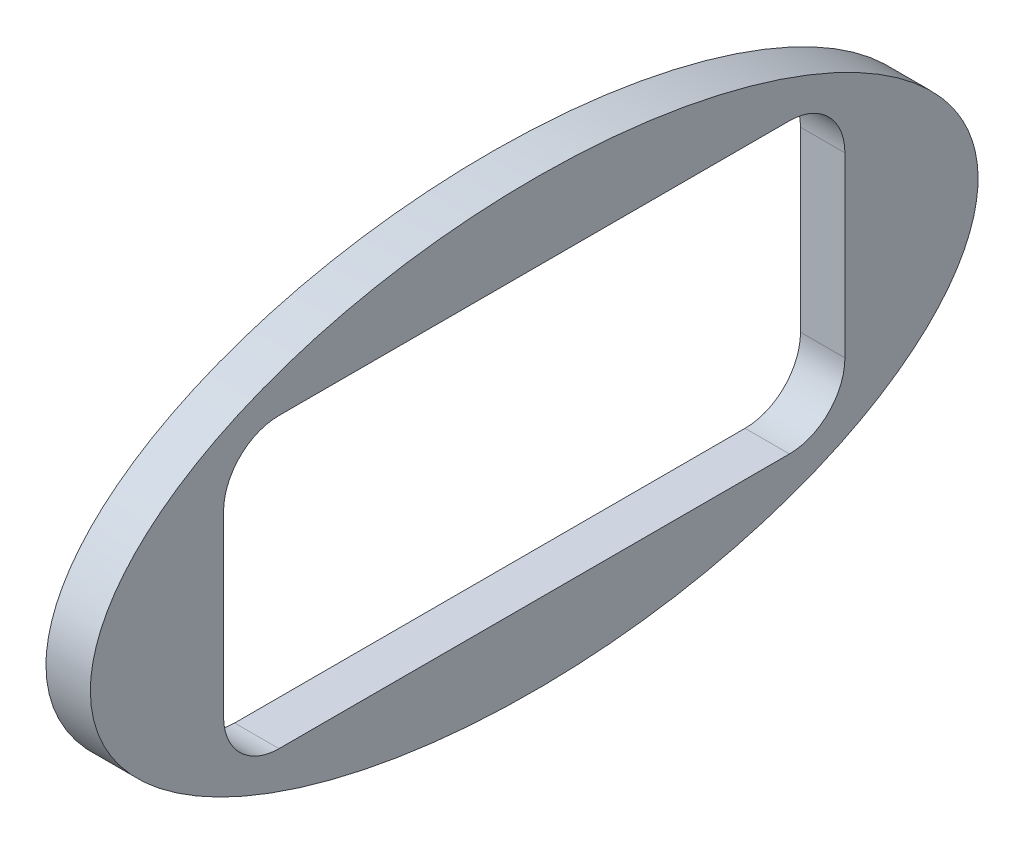
ISO-10303-21;
HEADER;
FILE_DESCRIPTION(('STEP AP214'),'2;1');
FILE_NAME('part.step','',(''),(''),'','','');
FILE_SCHEMA(('AUTOMOTIVE_DESIGN { 1 0 10303 214 1 1 1 1 }'));
ENDSEC;
DATA;
#1=APPLICATION_CONTEXT('core data for automotive mechanical design processes');
#2=APPLICATION_PROTOCOL_DEFINITION('international standard','automotive_design',2000,#1);
#3=PRODUCT_CONTEXT('',#1,'mechanical');
#4=PRODUCT('Part','Part','',(#3));
#5=PRODUCT_RELATED_PRODUCT_CATEGORY('part','',(#4));
#6=PRODUCT_DEFINITION_FORMATION('','',#4);
#7=PRODUCT_DEFINITION_CONTEXT('part definition',#1,'design');
#8=PRODUCT_DEFINITION('design','',#6,#7);
#9=PRODUCT_DEFINITION_SHAPE('','',#8);
#10=(LENGTH_UNIT() NAMED_UNIT(*) SI_UNIT(.MILLI.,.METRE.));
#11=(NAMED_UNIT(*) PLANE_ANGLE_UNIT() SI_UNIT($,.RADIAN.));
#12=(NAMED_UNIT(*) SI_UNIT($,.STERADIAN.) SOLID_ANGLE_UNIT());
#13=UNCERTAINTY_MEASURE_WITH_UNIT(LENGTH_MEASURE(1.E-05),#10,'distance_accuracy_value','');
#14=(GEOMETRIC_REPRESENTATION_CONTEXT(3) GLOBAL_UNCERTAINTY_ASSIGNED_CONTEXT((#13)) GLOBAL_UNIT_ASSIGNED_CONTEXT((#10,
#11,#12)) REPRESENTATION_CONTEXT('',''));
#15=CARTESIAN_POINT('',(0.,0.,0.));
#16=DIRECTION('',(0.,0.,1.));
#17=DIRECTION('',(1.,0.,0.));
#18=AXIS2_PLACEMENT_3D('',#15,#16,#17);
#19=CARTESIAN_POINT('',(1.,0.,0.));
#20=DIRECTION('',(1.,0.,0.));
#21=DIRECTION('',(0.,0.,-1.));
#22=AXIS2_PLACEMENT_3D('',#19,#20,#21);
#23=PLANE('',#22);
#24=CARTESIAN_POINT('',(1.,0.,0.));
#25=DIRECTION('',(1.,0.,0.));
#26=DIRECTION('',(0.,0.,1.));
#27=AXIS2_PLACEMENT_3D('',#24,#25,#26);
#28=ELLIPSE('',#27,10.,5.);
#29=CARTESIAN_POINT('',(1.,0.,10.));
#30=VERTEX_POINT('',#29);
#31=EDGE_CURVE('E11',#30,#30,#28,.T.);
#32=ORIENTED_EDGE('',*,*,#31,.T.);
#33=EDGE_LOOP('',(#32));
#34=FACE_BOUND('',#33,.T.);
#35=DIRECTION('',(0.,0.,-1.));
#36=VECTOR('',#35,1.);
#37=CARTESIAN_POINT('',(1.,-3.25,5.75));
#38=LINE('',#37,#36);
#39=CARTESIAN_POINT('',(1.,-3.25,5.75));
#40=VERTEX_POINT('',#39);
#41=CARTESIAN_POINT('',(1.,-3.25,-5.75));
#42=VERTEX_POINT('',#41);
#43=EDGE_CURVE('E110',#40,#42,#38,.T.);
#44=ORIENTED_EDGE('',*,*,#43,.F.);
#45=CARTESIAN_POINT('',(1.,-2.,5.75));
#46=DIRECTION('',(1.,0.,0.));
#47=DIRECTION('',(0.,0.,1.));
#48=AXIS2_PLACEMENT_3D('',#45,#46,#47);
#49=CIRCLE('',#48,1.25);
#50=CARTESIAN_POINT('',(1.,-2.,7.));
#51=VERTEX_POINT('',#50);
#52=EDGE_CURVE('E102',#51,#40,#49,.T.);
#53=ORIENTED_EDGE('',*,*,#52,.F.);
#54=DIRECTION('',(0.,-1.,0.));
#55=VECTOR('',#54,1.);
#56=CARTESIAN_POINT('',(1.,-2.,7.));
#57=LINE('',#56,#55);
#58=CARTESIAN_POINT('',(1.,2.,7.));
#59=VERTEX_POINT('',#58);
#60=EDGE_CURVE('E134',#59,#51,#57,.T.);
#61=ORIENTED_EDGE('',*,*,#60,.F.);
#62=CARTESIAN_POINT('',(1.,2.,5.75));
#63=DIRECTION('',(1.,0.,0.));
#64=DIRECTION('',(0.,0.,1.));
#65=AXIS2_PLACEMENT_3D('',#62,#63,#64);
#66=CIRCLE('',#65,1.25);
#67=CARTESIAN_POINT('',(1.,3.25,5.75));
#68=VERTEX_POINT('',#67);
#69=EDGE_CURVE('E132',#68,#59,#66,.T.);
#70=ORIENTED_EDGE('',*,*,#69,.F.);
#71=DIRECTION('',(0.,0.,1.));
#72=VECTOR('',#71,1.);
#73=CARTESIAN_POINT('',(1.,3.25,5.75));
#74=LINE('',#73,#72);
#75=CARTESIAN_POINT('',(1.,3.25,-5.75));
#76=VERTEX_POINT('',#75);
#77=EDGE_CURVE('E130',#76,#68,#74,.T.);
#78=ORIENTED_EDGE('',*,*,#77,.F.);
#79=CARTESIAN_POINT('',(1.,2.,-5.75));
#80=DIRECTION('',(1.,0.,0.));
#81=DIRECTION('',(0.,0.,1.));
#82=AXIS2_PLACEMENT_3D('',#79,#80,#81);
#83=CIRCLE('',#82,1.25);
#84=CARTESIAN_POINT('',(1.,2.,-7.));
#85=VERTEX_POINT('',#84);
#86=EDGE_CURVE('E128',#85,#76,#83,.T.);
#87=ORIENTED_EDGE('',*,*,#86,.F.);
#88=DIRECTION('',(0.,1.,0.));
#89=VECTOR('',#88,1.);
#90=CARTESIAN_POINT('',(1.,-2.,-7.));
#91=LINE('',#90,#89);
#92=CARTESIAN_POINT('',(1.,-2.,-7.));
#93=VERTEX_POINT('',#92);
#94=EDGE_CURVE('E124',#93,#85,#91,.T.);
#95=ORIENTED_EDGE('',*,*,#94,.F.);
#96=CARTESIAN_POINT('',(1.,-2.,-5.75));
#97=DIRECTION('',(1.,0.,0.));
#98=DIRECTION('',(0.,0.,-1.));
#99=AXIS2_PLACEMENT_3D('',#96,#97,#98);
#100=CIRCLE('',#99,1.25);
#101=EDGE_CURVE('E122',#42,#93,#100,.T.);
#102=ORIENTED_EDGE('',*,*,#101,.F.);
#103=EDGE_LOOP('',(#44,#53,#61,#70,#78,#87,#95,#102));
#104=FACE_BOUND('',#103,.T.);
#105=ADVANCED_FACE('F37',(#34,#104),#23,.T.);
#106=CARTESIAN_POINT('',(0.,0.,0.));
#107=DIRECTION('',(1.,0.,0.));
#108=DIRECTION('',(0.,0.,-1.));
#109=AXIS2_PLACEMENT_3D('',#106,#107,#108);
#110=PLANE('',#109);
#111=CARTESIAN_POINT('',(0.,0.,0.));
#112=DIRECTION('',(1.,0.,0.));
#113=DIRECTION('',(0.,0.,1.));
#114=AXIS2_PLACEMENT_3D('',#111,#112,#113);
#115=ELLIPSE('',#114,10.,5.);
#116=CARTESIAN_POINT('',(0.,0.,10.));
#117=VERTEX_POINT('',#116);
#118=EDGE_CURVE('E42',#117,#117,#115,.T.);
#119=ORIENTED_EDGE('',*,*,#118,.F.);
#120=EDGE_LOOP('',(#119));
#121=FACE_BOUND('',#120,.T.);
#122=CARTESIAN_POINT('',(0.,-2.,5.75));
#123=DIRECTION('',(1.,0.,0.));
#124=DIRECTION('',(0.,0.,1.));
#125=AXIS2_PLACEMENT_3D('',#122,#123,#124);
#126=CIRCLE('',#125,1.25);
#127=CARTESIAN_POINT('',(0.,-2.,7.));
#128=VERTEX_POINT('',#127);
#129=CARTESIAN_POINT('',(0.,-3.25,5.75));
#130=VERTEX_POINT('',#129);
#131=EDGE_CURVE('E60',#128,#130,#126,.T.);
#132=ORIENTED_EDGE('',*,*,#131,.T.);
#133=DIRECTION('',(0.,0.,-1.));
#134=VECTOR('',#133,1.);
#135=CARTESIAN_POINT('',(0.,-3.25,5.75));
#136=LINE('',#135,#134);
#137=CARTESIAN_POINT('',(0.,-3.25,-5.75));
#138=VERTEX_POINT('',#137);
#139=EDGE_CURVE('E117',#130,#138,#136,.T.);
#140=ORIENTED_EDGE('',*,*,#139,.T.);
#141=CARTESIAN_POINT('',(0.,-2.,-5.75));
#142=DIRECTION('',(1.,0.,0.));
#143=DIRECTION('',(0.,0.,-1.));
#144=AXIS2_PLACEMENT_3D('',#141,#142,#143);
#145=CIRCLE('',#144,1.25);
#146=CARTESIAN_POINT('',(0.,-2.,-7.));
#147=VERTEX_POINT('',#146);
#148=EDGE_CURVE('E138',#138,#147,#145,.T.);
#149=ORIENTED_EDGE('',*,*,#148,.T.);
#150=DIRECTION('',(0.,1.,0.));
#151=VECTOR('',#150,1.);
#152=CARTESIAN_POINT('',(0.,-2.,-7.));
#153=LINE('',#152,#151);
#154=CARTESIAN_POINT('',(0.,2.,-7.));
#155=VERTEX_POINT('',#154);
#156=EDGE_CURVE('E141',#147,#155,#153,.T.);
#157=ORIENTED_EDGE('',*,*,#156,.T.);
#158=CARTESIAN_POINT('',(0.,2.,-5.75));
#159=DIRECTION('',(1.,0.,0.));
#160=DIRECTION('',(0.,0.,1.));
#161=AXIS2_PLACEMENT_3D('',#158,#159,#160);
#162=CIRCLE('',#161,1.25);
#163=CARTESIAN_POINT('',(0.,3.25,-5.75));
#164=VERTEX_POINT('',#163);
#165=EDGE_CURVE('E144',#155,#164,#162,.T.);
#166=ORIENTED_EDGE('',*,*,#165,.T.);
#167=DIRECTION('',(0.,0.,1.));
#168=VECTOR('',#167,1.);
#169=CARTESIAN_POINT('',(0.,3.25,5.75));
#170=LINE('',#169,#168);
#171=CARTESIAN_POINT('',(0.,3.25,5.75));
#172=VERTEX_POINT('',#171);
#173=EDGE_CURVE('E147',#164,#172,#170,.T.);
#174=ORIENTED_EDGE('',*,*,#173,.T.);
#175=CARTESIAN_POINT('',(0.,2.,5.75));
#176=DIRECTION('',(1.,0.,0.));
#177=DIRECTION('',(0.,0.,1.));
#178=AXIS2_PLACEMENT_3D('',#175,#176,#177);
#179=CIRCLE('',#178,1.25);
#180=CARTESIAN_POINT('',(0.,2.,7.));
#181=VERTEX_POINT('',#180);
#182=EDGE_CURVE('E150',#172,#181,#179,.T.);
#183=ORIENTED_EDGE('',*,*,#182,.T.);
#184=DIRECTION('',(0.,-1.,0.));
#185=VECTOR('',#184,1.);
#186=CARTESIAN_POINT('',(0.,-2.,7.));
#187=LINE('',#186,#185);
#188=EDGE_CURVE('E111',#181,#128,#187,.T.);
#189=ORIENTED_EDGE('',*,*,#188,.T.);
#190=EDGE_LOOP('',(#132,#140,#149,#157,#166,#174,#183,#189));
#191=FACE_BOUND('',#190,.T.);
#192=ADVANCED_FACE('F172',(#121,#191),#110,.F.);
#193=DIRECTION('',(-1.,0.,0.));
#194=VECTOR('',#193,1.);
#195=SURFACE_OF_LINEAR_EXTRUSION('',#28,#194);
#196=ORIENTED_EDGE('',*,*,#31,.F.);
#197=EDGE_LOOP('',(#196));
#198=FACE_BOUND('',#197,.T.);
#199=ORIENTED_EDGE('',*,*,#118,.T.);
#200=EDGE_LOOP('',(#199));
#201=FACE_BOUND('',#200,.T.);
#202=ADVANCED_FACE('F39',(#198,#201),#195,.F.);
#203=CARTESIAN_POINT('',(1.,-2.,5.75));
#204=DIRECTION('',(-1.,0.,0.));
#205=DIRECTION('',(0.,0.,1.));
#206=AXIS2_PLACEMENT_3D('',#203,#204,#205);
#207=CYLINDRICAL_SURFACE('',#206,1.25);
#208=ORIENTED_EDGE('',*,*,#131,.F.);
#209=DIRECTION('',(-1.,0.,0.));
#210=VECTOR('',#209,1.);
#211=CARTESIAN_POINT('',(1.,-2.,7.));
#212=LINE('',#211,#210);
#213=EDGE_CURVE('E106',#51,#128,#212,.T.);
#214=ORIENTED_EDGE('',*,*,#213,.F.);
#215=ORIENTED_EDGE('',*,*,#52,.T.);
#216=DIRECTION('',(-1.,0.,0.));
#217=VECTOR('',#216,1.);
#218=CARTESIAN_POINT('',(1.,-3.25,5.75));
#219=LINE('',#218,#217);
#220=EDGE_CURVE('E105',#40,#130,#219,.T.);
#221=ORIENTED_EDGE('',*,*,#220,.T.);
#222=EDGE_LOOP('',(#208,#214,#215,#221));
#223=FACE_BOUND('',#222,.T.);
#224=ADVANCED_FACE('F104',(#223),#207,.F.);
#225=CARTESIAN_POINT('',(1.,-3.25,5.75));
#226=DIRECTION('',(0.,1.,0.));
#227=DIRECTION('',(0.,0.,1.));
#228=AXIS2_PLACEMENT_3D('',#225,#226,#227);
#229=PLANE('',#228);
#230=ORIENTED_EDGE('',*,*,#139,.F.);
#231=ORIENTED_EDGE('',*,*,#220,.F.);
#232=ORIENTED_EDGE('',*,*,#43,.T.);
#233=DIRECTION('',(-1.,0.,0.));
#234=VECTOR('',#233,1.);
#235=CARTESIAN_POINT('',(1.,-3.25,-5.75));
#236=LINE('',#235,#234);
#237=EDGE_CURVE('E118',#42,#138,#236,.T.);
#238=ORIENTED_EDGE('',*,*,#237,.T.);
#239=EDGE_LOOP('',(#230,#231,#232,#238));
#240=FACE_BOUND('',#239,.T.);
#241=ADVANCED_FACE('F114',(#240),#229,.T.);
#242=CARTESIAN_POINT('',(1.,-2.,-5.75));
#243=DIRECTION('',(-1.,0.,0.));
#244=DIRECTION('',(0.,0.,1.));
#245=AXIS2_PLACEMENT_3D('',#242,#243,#244);
#246=CYLINDRICAL_SURFACE('',#245,1.25);
#247=ORIENTED_EDGE('',*,*,#148,.F.);
#248=ORIENTED_EDGE('',*,*,#237,.F.);
#249=ORIENTED_EDGE('',*,*,#101,.T.);
#250=DIRECTION('',(-1.,0.,0.));
#251=VECTOR('',#250,1.);
#252=CARTESIAN_POINT('',(1.,-2.,-7.));
#253=LINE('',#252,#251);
#254=EDGE_CURVE('E163',#93,#147,#253,.T.);
#255=ORIENTED_EDGE('',*,*,#254,.T.);
#256=EDGE_LOOP('',(#247,#248,#249,#255));
#257=FACE_BOUND('',#256,.T.);
#258=ADVANCED_FACE('F168',(#257),#246,.F.);
#259=CARTESIAN_POINT('',(1.,-2.,-7.));
#260=DIRECTION('',(0.,0.,1.));
#261=DIRECTION('',(1.,0.,0.));
#262=AXIS2_PLACEMENT_3D('',#259,#260,#261);
#263=PLANE('',#262);
#264=ORIENTED_EDGE('',*,*,#156,.F.);
#265=ORIENTED_EDGE('',*,*,#254,.F.);
#266=ORIENTED_EDGE('',*,*,#94,.T.);
#267=DIRECTION('',(-1.,0.,0.));
#268=VECTOR('',#267,1.);
#269=CARTESIAN_POINT('',(1.,2.,-7.));
#270=LINE('',#269,#268);
#271=EDGE_CURVE('E161',#85,#155,#270,.T.);
#272=ORIENTED_EDGE('',*,*,#271,.T.);
#273=EDGE_LOOP('',(#264,#265,#266,#272));
#274=FACE_BOUND('',#273,.T.);
#275=ADVANCED_FACE('F190',(#274),#263,.T.);
#276=CARTESIAN_POINT('',(1.,2.,-5.75));
#277=DIRECTION('',(-1.,0.,0.));
#278=DIRECTION('',(0.,0.,1.));
#279=AXIS2_PLACEMENT_3D('',#276,#277,#278);
#280=CYLINDRICAL_SURFACE('',#279,1.25);
#281=ORIENTED_EDGE('',*,*,#165,.F.);
#282=ORIENTED_EDGE('',*,*,#271,.F.);
#283=ORIENTED_EDGE('',*,*,#86,.T.);
#284=DIRECTION('',(-1.,0.,0.));
#285=VECTOR('',#284,1.);
#286=CARTESIAN_POINT('',(1.,3.25,-5.75));
#287=LINE('',#286,#285);
#288=EDGE_CURVE('E159',#76,#164,#287,.T.);
#289=ORIENTED_EDGE('',*,*,#288,.T.);
#290=EDGE_LOOP('',(#281,#282,#283,#289));
#291=FACE_BOUND('',#290,.T.);
#292=ADVANCED_FACE('F187',(#291),#280,.F.);
#293=CARTESIAN_POINT('',(1.,3.25,5.75));
#294=DIRECTION('',(0.,-1.,0.));
#295=DIRECTION('',(0.,0.,-1.));
#296=AXIS2_PLACEMENT_3D('',#293,#294,#295);
#297=PLANE('',#296);
#298=ORIENTED_EDGE('',*,*,#173,.F.);
#299=ORIENTED_EDGE('',*,*,#288,.F.);
#300=ORIENTED_EDGE('',*,*,#77,.T.);
#301=DIRECTION('',(-1.,0.,0.));
#302=VECTOR('',#301,1.);
#303=CARTESIAN_POINT('',(1.,3.25,5.75));
#304=LINE('',#303,#302);
#305=EDGE_CURVE('E157',#68,#172,#304,.T.);
#306=ORIENTED_EDGE('',*,*,#305,.T.);
#307=EDGE_LOOP('',(#298,#299,#300,#306));
#308=FACE_BOUND('',#307,.T.);
#309=ADVANCED_FACE('F183',(#308),#297,.T.);
#310=CARTESIAN_POINT('',(1.,2.,5.75));
#311=DIRECTION('',(-1.,0.,0.));
#312=DIRECTION('',(0.,0.,1.));
#313=AXIS2_PLACEMENT_3D('',#310,#311,#312);
#314=CYLINDRICAL_SURFACE('',#313,1.25);
#315=ORIENTED_EDGE('',*,*,#182,.F.);
#316=ORIENTED_EDGE('',*,*,#305,.F.);
#317=ORIENTED_EDGE('',*,*,#69,.T.);
#318=DIRECTION('',(-1.,0.,0.));
#319=VECTOR('',#318,1.);
#320=CARTESIAN_POINT('',(1.,2.,7.));
#321=LINE('',#320,#319);
#322=EDGE_CURVE('E52',#59,#181,#321,.T.);
#323=ORIENTED_EDGE('',*,*,#322,.T.);
#324=EDGE_LOOP('',(#315,#316,#317,#323));
#325=FACE_BOUND('',#324,.T.);
#326=ADVANCED_FACE('F180',(#325),#314,.F.);
#327=CARTESIAN_POINT('',(1.,-2.,7.));
#328=DIRECTION('',(0.,0.,-1.));
#329=DIRECTION('',(-1.,0.,0.));
#330=AXIS2_PLACEMENT_3D('',#327,#328,#329);
#331=PLANE('',#330);
#332=ORIENTED_EDGE('',*,*,#188,.F.);
#333=ORIENTED_EDGE('',*,*,#322,.F.);
#334=ORIENTED_EDGE('',*,*,#60,.T.);
#335=ORIENTED_EDGE('',*,*,#213,.T.);
#336=EDGE_LOOP('',(#332,#333,#334,#335));
#337=FACE_BOUND('',#336,.T.);
#338=ADVANCED_FACE('F174',(#337),#331,.T.);
#339=CLOSED_SHELL('',(#105,#192,#202,#224,#241,#258,#275,#292,#309,#326,#338));
#340=MANIFOLD_SOLID_BREP('B2',#339);
#341=ADVANCED_BREP_SHAPE_REPRESENTATION('',(#18,#340),#14);
#342=SHAPE_DEFINITION_REPRESENTATION(#9,#341);
ENDSEC;
END-ISO-10303-21;
